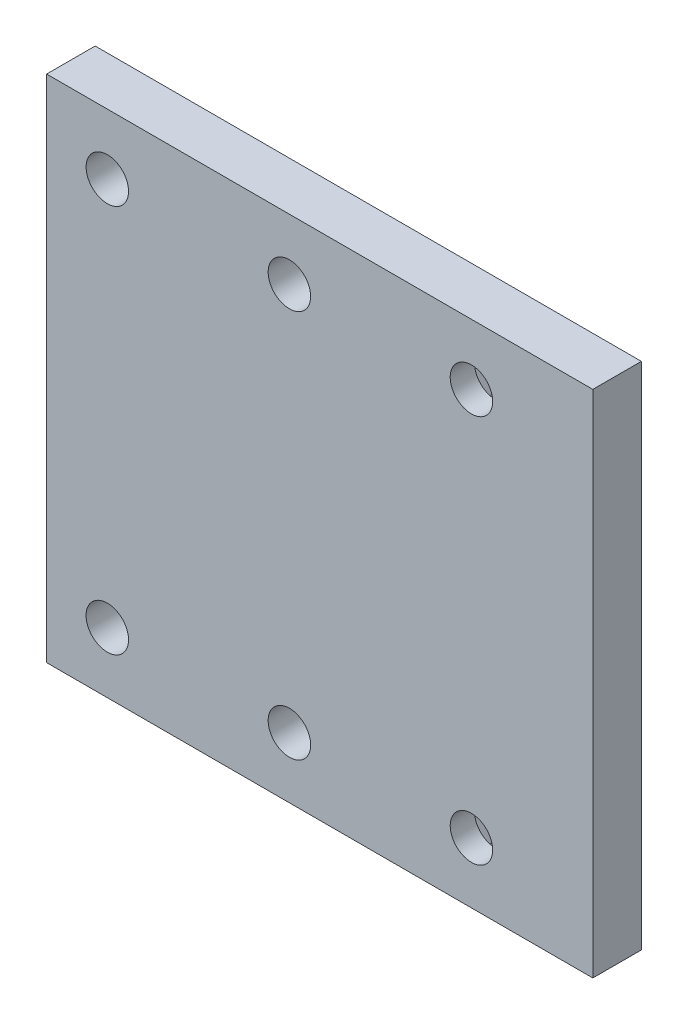
ISO-10303-21;
HEADER;
FILE_DESCRIPTION(('STEP AP214'),'2;1');
FILE_NAME('part.step','',(''),(''),'','','');
FILE_SCHEMA(('AUTOMOTIVE_DESIGN { 1 0 10303 214 1 1 1 1 }'));
ENDSEC;
DATA;
#1=APPLICATION_CONTEXT('core data for automotive mechanical design processes');
#2=APPLICATION_PROTOCOL_DEFINITION('international standard','automotive_design',2000,#1);
#3=PRODUCT_CONTEXT('',#1,'mechanical');
#4=PRODUCT('Part','Part','',(#3));
#5=PRODUCT_RELATED_PRODUCT_CATEGORY('part','',(#4));
#6=PRODUCT_DEFINITION_FORMATION('','',#4);
#7=PRODUCT_DEFINITION_CONTEXT('part definition',#1,'design');
#8=PRODUCT_DEFINITION('design','',#6,#7);
#9=PRODUCT_DEFINITION_SHAPE('','',#8);
#10=(LENGTH_UNIT() NAMED_UNIT(*) SI_UNIT(.MILLI.,.METRE.));
#11=(NAMED_UNIT(*) PLANE_ANGLE_UNIT() SI_UNIT($,.RADIAN.));
#12=(NAMED_UNIT(*) SI_UNIT($,.STERADIAN.) SOLID_ANGLE_UNIT());
#13=UNCERTAINTY_MEASURE_WITH_UNIT(LENGTH_MEASURE(1.E-05),#10,'distance_accuracy_value','');
#14=(GEOMETRIC_REPRESENTATION_CONTEXT(3) GLOBAL_UNCERTAINTY_ASSIGNED_CONTEXT((#13)) GLOBAL_UNIT_ASSIGNED_CONTEXT((#10,
#11,#12)) REPRESENTATION_CONTEXT('',''));
#15=CARTESIAN_POINT('',(0.,0.,0.));
#16=DIRECTION('',(0.,0.,1.));
#17=DIRECTION('',(1.,0.,0.));
#18=AXIS2_PLACEMENT_3D('',#15,#16,#17);
#19=CARTESIAN_POINT('',(12.5,-16.,0.));
#20=DIRECTION('',(0.,0.,1.));
#21=DIRECTION('',(1.,0.,0.));
#22=AXIS2_PLACEMENT_3D('',#19,#20,#21);
#23=CYLINDRICAL_SURFACE('',#22,1.75);
#24=CARTESIAN_POINT('',(12.5,-16.,4.));
#25=DIRECTION('',(0.,0.,1.));
#26=DIRECTION('',(-1.,0.,0.));
#27=AXIS2_PLACEMENT_3D('',#24,#25,#26);
#28=CIRCLE('',#27,1.75);
#29=CARTESIAN_POINT('',(10.75,-16.,4.));
#30=VERTEX_POINT('',#29);
#31=EDGE_CURVE('E250',#30,#30,#28,.T.);
#32=ORIENTED_EDGE('',*,*,#31,.T.);
#33=EDGE_LOOP('',(#32));
#34=FACE_BOUND('',#33,.T.);
#35=CARTESIAN_POINT('',(12.5,-16.,2.));
#36=DIRECTION('',(0.,0.,-1.));
#37=DIRECTION('',(-1.,0.,0.));
#38=AXIS2_PLACEMENT_3D('',#35,#36,#37);
#39=CIRCLE('',#38,1.75);
#40=CARTESIAN_POINT('',(10.75,-16.,2.));
#41=VERTEX_POINT('',#40);
#42=EDGE_CURVE('E240',#41,#41,#39,.F.);
#43=ORIENTED_EDGE('',*,*,#42,.F.);
#44=EDGE_LOOP('',(#43));
#45=FACE_BOUND('',#44,.T.);
#46=ADVANCED_FACE('F33',(#34,#45),#23,.F.);
#47=CARTESIAN_POINT('',(22.5,21.,4.));
#48=DIRECTION('',(-1.,0.,0.));
#49=DIRECTION('',(0.,-1.,0.));
#50=AXIS2_PLACEMENT_3D('',#47,#48,#49);
#51=PLANE('',#50);
#52=DIRECTION('',(0.,1.,0.));
#53=VECTOR('',#52,1.);
#54=CARTESIAN_POINT('',(22.5,21.,0.));
#55=LINE('',#54,#53);
#56=CARTESIAN_POINT('',(22.5,-21.,0.));
#57=VERTEX_POINT('',#56);
#58=CARTESIAN_POINT('',(22.5,21.,0.));
#59=VERTEX_POINT('',#58);
#60=EDGE_CURVE('E278',#57,#59,#55,.T.);
#61=ORIENTED_EDGE('',*,*,#60,.T.);
#62=DIRECTION('',(0.,0.,-1.));
#63=VECTOR('',#62,1.);
#64=CARTESIAN_POINT('',(22.5,21.,4.));
#65=LINE('',#64,#63);
#66=CARTESIAN_POINT('',(22.5,21.,4.));
#67=VERTEX_POINT('',#66);
#68=EDGE_CURVE('E11',#67,#59,#65,.T.);
#69=ORIENTED_EDGE('',*,*,#68,.F.);
#70=DIRECTION('',(0.,1.,0.));
#71=VECTOR('',#70,1.);
#72=CARTESIAN_POINT('',(22.5,21.,4.));
#73=LINE('',#72,#71);
#74=CARTESIAN_POINT('',(22.5,-21.,4.));
#75=VERTEX_POINT('',#74);
#76=EDGE_CURVE('E281',#75,#67,#73,.T.);
#77=ORIENTED_EDGE('',*,*,#76,.F.);
#78=DIRECTION('',(0.,0.,-1.));
#79=VECTOR('',#78,1.);
#80=CARTESIAN_POINT('',(22.5,-21.,4.));
#81=LINE('',#80,#79);
#82=EDGE_CURVE('E291',#75,#57,#81,.T.);
#83=ORIENTED_EDGE('',*,*,#82,.T.);
#84=EDGE_LOOP('',(#61,#69,#77,#83));
#85=FACE_BOUND('',#84,.T.);
#86=ADVANCED_FACE('F35',(#85),#51,.F.);
#87=CARTESIAN_POINT('',(-22.5,21.,4.));
#88=DIRECTION('',(0.,-1.,0.));
#89=DIRECTION('',(0.,0.,-1.));
#90=AXIS2_PLACEMENT_3D('',#87,#88,#89);
#91=PLANE('',#90);
#92=DIRECTION('',(-1.,0.,0.));
#93=VECTOR('',#92,1.);
#94=CARTESIAN_POINT('',(-22.5,21.,0.));
#95=LINE('',#94,#93);
#96=CARTESIAN_POINT('',(-22.5,21.,0.));
#97=VERTEX_POINT('',#96);
#98=EDGE_CURVE('E294',#59,#97,#95,.T.);
#99=ORIENTED_EDGE('',*,*,#98,.T.);
#100=DIRECTION('',(0.,0.,-1.));
#101=VECTOR('',#100,1.);
#102=CARTESIAN_POINT('',(-22.5,21.,4.));
#103=LINE('',#102,#101);
#104=CARTESIAN_POINT('',(-22.5,21.,4.));
#105=VERTEX_POINT('',#104);
#106=EDGE_CURVE('E42',#105,#97,#103,.T.);
#107=ORIENTED_EDGE('',*,*,#106,.F.);
#108=DIRECTION('',(-1.,0.,0.));
#109=VECTOR('',#108,1.);
#110=CARTESIAN_POINT('',(-22.5,21.,4.));
#111=LINE('',#110,#109);
#112=EDGE_CURVE('E284',#67,#105,#111,.T.);
#113=ORIENTED_EDGE('',*,*,#112,.F.);
#114=ORIENTED_EDGE('',*,*,#68,.T.);
#115=EDGE_LOOP('',(#99,#107,#113,#114));
#116=FACE_BOUND('',#115,.T.);
#117=ADVANCED_FACE('F318',(#116),#91,.F.);
#118=CARTESIAN_POINT('',(-22.5,21.,4.));
#119=DIRECTION('',(1.,0.,0.));
#120=DIRECTION('',(0.,0.,-1.));
#121=AXIS2_PLACEMENT_3D('',#118,#119,#120);
#122=PLANE('',#121);
#123=DIRECTION('',(0.,-1.,0.));
#124=VECTOR('',#123,1.);
#125=CARTESIAN_POINT('',(-22.5,21.,0.));
#126=LINE('',#125,#124);
#127=CARTESIAN_POINT('',(-22.5,-21.,0.));
#128=VERTEX_POINT('',#127);
#129=EDGE_CURVE('E296',#97,#128,#126,.T.);
#130=ORIENTED_EDGE('',*,*,#129,.T.);
#131=DIRECTION('',(0.,0.,-1.));
#132=VECTOR('',#131,1.);
#133=CARTESIAN_POINT('',(-22.5,-21.,4.));
#134=LINE('',#133,#132);
#135=CARTESIAN_POINT('',(-22.5,-21.,4.));
#136=VERTEX_POINT('',#135);
#137=EDGE_CURVE('E301',#136,#128,#134,.T.);
#138=ORIENTED_EDGE('',*,*,#137,.F.);
#139=DIRECTION('',(0.,-1.,0.));
#140=VECTOR('',#139,1.);
#141=CARTESIAN_POINT('',(-22.5,21.,4.));
#142=LINE('',#141,#140);
#143=EDGE_CURVE('E287',#105,#136,#142,.T.);
#144=ORIENTED_EDGE('',*,*,#143,.F.);
#145=ORIENTED_EDGE('',*,*,#106,.T.);
#146=EDGE_LOOP('',(#130,#138,#144,#145));
#147=FACE_BOUND('',#146,.T.);
#148=ADVANCED_FACE('F353',(#147),#122,.F.);
#149=CARTESIAN_POINT('',(-22.5,-21.,4.));
#150=DIRECTION('',(0.,1.,0.));
#151=DIRECTION('',(0.,0.,1.));
#152=AXIS2_PLACEMENT_3D('',#149,#150,#151);
#153=PLANE('',#152);
#154=DIRECTION('',(1.,0.,0.));
#155=VECTOR('',#154,1.);
#156=CARTESIAN_POINT('',(-22.5,-21.,0.));
#157=LINE('',#156,#155);
#158=EDGE_CURVE('E285',#128,#57,#157,.T.);
#159=ORIENTED_EDGE('',*,*,#158,.T.);
#160=ORIENTED_EDGE('',*,*,#82,.F.);
#161=DIRECTION('',(1.,0.,0.));
#162=VECTOR('',#161,1.);
#163=CARTESIAN_POINT('',(-22.5,-21.,4.));
#164=LINE('',#163,#162);
#165=EDGE_CURVE('E289',#136,#75,#164,.T.);
#166=ORIENTED_EDGE('',*,*,#165,.F.);
#167=ORIENTED_EDGE('',*,*,#137,.T.);
#168=EDGE_LOOP('',(#159,#160,#166,#167));
#169=FACE_BOUND('',#168,.T.);
#170=ADVANCED_FACE('F346',(#169),#153,.F.);
#171=CARTESIAN_POINT('',(0.,0.,4.));
#172=DIRECTION('',(0.,0.,1.));
#173=DIRECTION('',(1.,0.,0.));
#174=AXIS2_PLACEMENT_3D('',#171,#172,#173);
#175=PLANE('',#174);
#176=ORIENTED_EDGE('',*,*,#31,.F.);
#177=EDGE_LOOP('',(#176));
#178=FACE_BOUND('',#177,.T.);
#179=CARTESIAN_POINT('',(12.5,16.,4.));
#180=DIRECTION('',(0.,0.,1.));
#181=DIRECTION('',(1.,0.,0.));
#182=AXIS2_PLACEMENT_3D('',#179,#180,#181);
#183=CIRCLE('',#182,1.75);
#184=CARTESIAN_POINT('',(14.25,16.,4.));
#185=VERTEX_POINT('',#184);
#186=EDGE_CURVE('E253',#185,#185,#183,.T.);
#187=ORIENTED_EDGE('',*,*,#186,.F.);
#188=EDGE_LOOP('',(#187));
#189=FACE_BOUND('',#188,.T.);
#190=CARTESIAN_POINT('',(-17.5,-16.,4.));
#191=DIRECTION('',(0.,0.,1.));
#192=DIRECTION('',(-1.,0.,0.));
#193=AXIS2_PLACEMENT_3D('',#190,#191,#192);
#194=CIRCLE('',#193,1.75);
#195=CARTESIAN_POINT('',(-19.25,-16.,4.));
#196=VERTEX_POINT('',#195);
#197=EDGE_CURVE('E256',#196,#196,#194,.T.);
#198=ORIENTED_EDGE('',*,*,#197,.F.);
#199=EDGE_LOOP('',(#198));
#200=FACE_BOUND('',#199,.T.);
#201=CARTESIAN_POINT('',(-2.5,-16.,4.));
#202=DIRECTION('',(0.,0.,1.));
#203=DIRECTION('',(-1.,0.,0.));
#204=AXIS2_PLACEMENT_3D('',#201,#202,#203);
#205=CIRCLE('',#204,1.75);
#206=CARTESIAN_POINT('',(-4.25,-16.,4.));
#207=VERTEX_POINT('',#206);
#208=EDGE_CURVE('E260',#207,#207,#205,.T.);
#209=ORIENTED_EDGE('',*,*,#208,.F.);
#210=EDGE_LOOP('',(#209));
#211=FACE_BOUND('',#210,.T.);
#212=CARTESIAN_POINT('',(-2.5,16.,4.));
#213=DIRECTION('',(0.,0.,1.));
#214=DIRECTION('',(1.,0.,0.));
#215=AXIS2_PLACEMENT_3D('',#212,#213,#214);
#216=CIRCLE('',#215,1.75);
#217=CARTESIAN_POINT('',(-0.750000000000001,16.,4.));
#218=VERTEX_POINT('',#217);
#219=EDGE_CURVE('E266',#218,#218,#216,.T.);
#220=ORIENTED_EDGE('',*,*,#219,.F.);
#221=EDGE_LOOP('',(#220));
#222=FACE_BOUND('',#221,.T.);
#223=CARTESIAN_POINT('',(-17.5,16.,4.));
#224=DIRECTION('',(0.,0.,1.));
#225=DIRECTION('',(1.,0.,0.));
#226=AXIS2_PLACEMENT_3D('',#223,#224,#225);
#227=CIRCLE('',#226,1.75);
#228=CARTESIAN_POINT('',(-15.75,16.,4.));
#229=VERTEX_POINT('',#228);
#230=EDGE_CURVE('E272',#229,#229,#227,.T.);
#231=ORIENTED_EDGE('',*,*,#230,.F.);
#232=EDGE_LOOP('',(#231));
#233=FACE_BOUND('',#232,.T.);
#234=ORIENTED_EDGE('',*,*,#76,.T.);
#235=ORIENTED_EDGE('',*,*,#112,.T.);
#236=ORIENTED_EDGE('',*,*,#143,.T.);
#237=ORIENTED_EDGE('',*,*,#165,.T.);
#238=EDGE_LOOP('',(#234,#235,#236,#237));
#239=FACE_BOUND('',#238,.T.);
#240=ADVANCED_FACE('F343',(#178,#189,#200,#211,#222,#233,#239),#175,.T.);
#241=CARTESIAN_POINT('',(0.,0.,0.));
#242=DIRECTION('',(0.,0.,1.));
#243=DIRECTION('',(1.,0.,0.));
#244=AXIS2_PLACEMENT_3D('',#241,#242,#243);
#245=PLANE('',#244);
#246=DIRECTION('',(0.5,-0.866025403784439,0.));
#247=VECTOR('',#246,1.);
#248=CARTESIAN_POINT('',(15.7908965343809,16.,0.));
#249=LINE('',#248,#247);
#250=CARTESIAN_POINT('',(14.1454482671904,18.85,0.));
#251=VERTEX_POINT('',#250);
#252=CARTESIAN_POINT('',(15.7908965343809,16.,0.));
#253=VERTEX_POINT('',#252);
#254=EDGE_CURVE('E184',#251,#253,#249,.T.);
#255=ORIENTED_EDGE('',*,*,#254,.F.);
#256=DIRECTION('',(1.,0.,0.));
#257=VECTOR('',#256,1.);
#258=CARTESIAN_POINT('',(14.1454482671904,18.85,0.));
#259=LINE('',#258,#257);
#260=CARTESIAN_POINT('',(10.8545517328096,18.85,0.));
#261=VERTEX_POINT('',#260);
#262=EDGE_CURVE('E50',#261,#251,#259,.T.);
#263=ORIENTED_EDGE('',*,*,#262,.F.);
#264=DIRECTION('',(0.5,0.866025403784438,0.));
#265=VECTOR('',#264,1.);
#266=CARTESIAN_POINT('',(10.8545517328096,18.85,0.));
#267=LINE('',#266,#265);
#268=CARTESIAN_POINT('',(9.20910346561914,16.,0.));
#269=VERTEX_POINT('',#268);
#270=EDGE_CURVE('E170',#269,#261,#267,.T.);
#271=ORIENTED_EDGE('',*,*,#270,.F.);
#272=DIRECTION('',(-0.5,0.866025403784439,0.));
#273=VECTOR('',#272,1.);
#274=CARTESIAN_POINT('',(9.20910346561914,16.,0.));
#275=LINE('',#274,#273);
#276=CARTESIAN_POINT('',(10.8545517328096,13.15,0.));
#277=VERTEX_POINT('',#276);
#278=EDGE_CURVE('E173',#277,#269,#275,.T.);
#279=ORIENTED_EDGE('',*,*,#278,.F.);
#280=DIRECTION('',(-1.,0.,0.));
#281=VECTOR('',#280,1.);
#282=CARTESIAN_POINT('',(10.8545517328096,13.15,0.));
#283=LINE('',#282,#281);
#284=CARTESIAN_POINT('',(14.1454482671904,13.15,0.));
#285=VERTEX_POINT('',#284);
#286=EDGE_CURVE('E189',#285,#277,#283,.T.);
#287=ORIENTED_EDGE('',*,*,#286,.F.);
#288=DIRECTION('',(-0.5,-0.866025403784439,0.));
#289=VECTOR('',#288,1.);
#290=CARTESIAN_POINT('',(14.1454482671904,13.15,0.));
#291=LINE('',#290,#289);
#292=EDGE_CURVE('E186',#253,#285,#291,.T.);
#293=ORIENTED_EDGE('',*,*,#292,.F.);
#294=EDGE_LOOP('',(#255,#263,#271,#279,#287,#293));
#295=FACE_BOUND('',#294,.T.);
#296=DIRECTION('',(0.5,0.866025403784439,0.));
#297=VECTOR('',#296,1.);
#298=CARTESIAN_POINT('',(9.20910346561914,-16.,0.));
#299=LINE('',#298,#297);
#300=CARTESIAN_POINT('',(9.20910346561914,-16.,0.));
#301=VERTEX_POINT('',#300);
#302=CARTESIAN_POINT('',(10.8545517328096,-13.15,0.));
#303=VERTEX_POINT('',#302);
#304=EDGE_CURVE('E224',#301,#303,#299,.T.);
#305=ORIENTED_EDGE('',*,*,#304,.F.);
#306=DIRECTION('',(-0.5,0.866025403784438,0.));
#307=VECTOR('',#306,1.);
#308=CARTESIAN_POINT('',(10.8545517328096,-18.85,0.));
#309=LINE('',#308,#307);
#310=CARTESIAN_POINT('',(10.8545517328096,-18.85,0.));
#311=VERTEX_POINT('',#310);
#312=EDGE_CURVE('E58',#311,#301,#309,.T.);
#313=ORIENTED_EDGE('',*,*,#312,.F.);
#314=DIRECTION('',(-1.,0.,0.));
#315=VECTOR('',#314,1.);
#316=CARTESIAN_POINT('',(14.1454482671904,-18.85,0.));
#317=LINE('',#316,#315);
#318=CARTESIAN_POINT('',(14.1454482671904,-18.85,0.));
#319=VERTEX_POINT('',#318);
#320=EDGE_CURVE('E207',#319,#311,#317,.T.);
#321=ORIENTED_EDGE('',*,*,#320,.F.);
#322=DIRECTION('',(-0.5,-0.866025403784439,0.));
#323=VECTOR('',#322,1.);
#324=CARTESIAN_POINT('',(15.7908965343809,-16.,0.));
#325=LINE('',#324,#323);
#326=CARTESIAN_POINT('',(15.7908965343809,-16.,0.));
#327=VERTEX_POINT('',#326);
#328=EDGE_CURVE('E233',#327,#319,#325,.T.);
#329=ORIENTED_EDGE('',*,*,#328,.F.);
#330=DIRECTION('',(0.5,-0.866025403784439,0.));
#331=VECTOR('',#330,1.);
#332=CARTESIAN_POINT('',(14.1454482671904,-13.15,0.));
#333=LINE('',#332,#331);
#334=CARTESIAN_POINT('',(14.1454482671904,-13.15,0.));
#335=VERTEX_POINT('',#334);
#336=EDGE_CURVE('E230',#335,#327,#333,.T.);
#337=ORIENTED_EDGE('',*,*,#336,.F.);
#338=DIRECTION('',(1.,0.,0.));
#339=VECTOR('',#338,1.);
#340=CARTESIAN_POINT('',(10.8545517328096,-13.15,0.));
#341=LINE('',#340,#339);
#342=EDGE_CURVE('E227',#303,#335,#341,.T.);
#343=ORIENTED_EDGE('',*,*,#342,.F.);
#344=EDGE_LOOP('',(#305,#313,#321,#329,#337,#343));
#345=FACE_BOUND('',#344,.T.);
#346=CARTESIAN_POINT('',(-17.5,-16.,0.));
#347=DIRECTION('',(0.,0.,1.));
#348=DIRECTION('',(-1.,0.,0.));
#349=AXIS2_PLACEMENT_3D('',#346,#347,#348);
#350=CIRCLE('',#349,1.75);
#351=CARTESIAN_POINT('',(-19.25,-16.,0.));
#352=VERTEX_POINT('',#351);
#353=EDGE_CURVE('E257',#352,#352,#350,.T.);
#354=ORIENTED_EDGE('',*,*,#353,.T.);
#355=EDGE_LOOP('',(#354));
#356=FACE_BOUND('',#355,.T.);
#357=CARTESIAN_POINT('',(-2.5,-16.,0.));
#358=DIRECTION('',(0.,0.,1.));
#359=DIRECTION('',(-1.,0.,0.));
#360=AXIS2_PLACEMENT_3D('',#357,#358,#359);
#361=CIRCLE('',#360,1.75);
#362=CARTESIAN_POINT('',(-4.25,-16.,0.));
#363=VERTEX_POINT('',#362);
#364=EDGE_CURVE('E263',#363,#363,#361,.T.);
#365=ORIENTED_EDGE('',*,*,#364,.T.);
#366=EDGE_LOOP('',(#365));
#367=FACE_BOUND('',#366,.T.);
#368=CARTESIAN_POINT('',(-2.5,16.,0.));
#369=DIRECTION('',(0.,0.,1.));
#370=DIRECTION('',(1.,0.,0.));
#371=AXIS2_PLACEMENT_3D('',#368,#369,#370);
#372=CIRCLE('',#371,1.75);
#373=CARTESIAN_POINT('',(-0.750000000000001,16.,0.));
#374=VERTEX_POINT('',#373);
#375=EDGE_CURVE('E269',#374,#374,#372,.T.);
#376=ORIENTED_EDGE('',*,*,#375,.T.);
#377=EDGE_LOOP('',(#376));
#378=FACE_BOUND('',#377,.T.);
#379=CARTESIAN_POINT('',(-17.5,16.,0.));
#380=DIRECTION('',(0.,0.,1.));
#381=DIRECTION('',(1.,0.,0.));
#382=AXIS2_PLACEMENT_3D('',#379,#380,#381);
#383=CIRCLE('',#382,1.75);
#384=CARTESIAN_POINT('',(-15.75,16.,0.));
#385=VERTEX_POINT('',#384);
#386=EDGE_CURVE('E275',#385,#385,#383,.T.);
#387=ORIENTED_EDGE('',*,*,#386,.T.);
#388=EDGE_LOOP('',(#387));
#389=FACE_BOUND('',#388,.T.);
#390=ORIENTED_EDGE('',*,*,#60,.F.);
#391=ORIENTED_EDGE('',*,*,#158,.F.);
#392=ORIENTED_EDGE('',*,*,#129,.F.);
#393=ORIENTED_EDGE('',*,*,#98,.F.);
#394=EDGE_LOOP('',(#390,#391,#392,#393));
#395=FACE_BOUND('',#394,.T.);
#396=ADVANCED_FACE('F341',(#295,#345,#356,#367,#378,#389,#395),#245,.F.);
#397=CARTESIAN_POINT('',(-17.5,16.,0.));
#398=DIRECTION('',(0.,0.,1.));
#399=DIRECTION('',(1.,0.,0.));
#400=AXIS2_PLACEMENT_3D('',#397,#398,#399);
#401=CYLINDRICAL_SURFACE('',#400,1.75);
#402=ORIENTED_EDGE('',*,*,#386,.F.);
#403=EDGE_LOOP('',(#402));
#404=FACE_BOUND('',#403,.T.);
#405=ORIENTED_EDGE('',*,*,#230,.T.);
#406=EDGE_LOOP('',(#405));
#407=FACE_BOUND('',#406,.T.);
#408=ADVANCED_FACE('F337',(#404,#407),#401,.F.);
#409=CARTESIAN_POINT('',(-2.5,16.,0.));
#410=DIRECTION('',(0.,0.,1.));
#411=DIRECTION('',(1.,0.,0.));
#412=AXIS2_PLACEMENT_3D('',#409,#410,#411);
#413=CYLINDRICAL_SURFACE('',#412,1.75);
#414=ORIENTED_EDGE('',*,*,#375,.F.);
#415=EDGE_LOOP('',(#414));
#416=FACE_BOUND('',#415,.T.);
#417=ORIENTED_EDGE('',*,*,#219,.T.);
#418=EDGE_LOOP('',(#417));
#419=FACE_BOUND('',#418,.T.);
#420=ADVANCED_FACE('F333',(#416,#419),#413,.F.);
#421=CARTESIAN_POINT('',(-2.5,-16.,0.));
#422=DIRECTION('',(0.,0.,1.));
#423=DIRECTION('',(1.,0.,0.));
#424=AXIS2_PLACEMENT_3D('',#421,#422,#423);
#425=CYLINDRICAL_SURFACE('',#424,1.75);
#426=ORIENTED_EDGE('',*,*,#364,.F.);
#427=EDGE_LOOP('',(#426));
#428=FACE_BOUND('',#427,.T.);
#429=ORIENTED_EDGE('',*,*,#208,.T.);
#430=EDGE_LOOP('',(#429));
#431=FACE_BOUND('',#430,.T.);
#432=ADVANCED_FACE('F329',(#428,#431),#425,.F.);
#433=CARTESIAN_POINT('',(-17.5,-16.,0.));
#434=DIRECTION('',(0.,0.,1.));
#435=DIRECTION('',(1.,0.,0.));
#436=AXIS2_PLACEMENT_3D('',#433,#434,#435);
#437=CYLINDRICAL_SURFACE('',#436,1.75);
#438=ORIENTED_EDGE('',*,*,#353,.F.);
#439=EDGE_LOOP('',(#438));
#440=FACE_BOUND('',#439,.T.);
#441=ORIENTED_EDGE('',*,*,#197,.T.);
#442=EDGE_LOOP('',(#441));
#443=FACE_BOUND('',#442,.T.);
#444=ADVANCED_FACE('F326',(#440,#443),#437,.F.);
#445=CARTESIAN_POINT('',(12.5,16.,0.));
#446=DIRECTION('',(0.,0.,1.));
#447=DIRECTION('',(1.,0.,0.));
#448=AXIS2_PLACEMENT_3D('',#445,#446,#447);
#449=CYLINDRICAL_SURFACE('',#448,1.75);
#450=CARTESIAN_POINT('',(12.5,16.,2.));
#451=DIRECTION('',(0.,0.,1.));
#452=DIRECTION('',(1.,0.,0.));
#453=AXIS2_PLACEMENT_3D('',#450,#451,#452);
#454=CIRCLE('',#453,1.75);
#455=CARTESIAN_POINT('',(14.25,16.,2.));
#456=VERTEX_POINT('',#455);
#457=EDGE_CURVE('E37',#456,#456,#454,.F.);
#458=ORIENTED_EDGE('',*,*,#457,.T.);
#459=EDGE_LOOP('',(#458));
#460=FACE_BOUND('',#459,.T.);
#461=ORIENTED_EDGE('',*,*,#186,.T.);
#462=EDGE_LOOP('',(#461));
#463=FACE_BOUND('',#462,.T.);
#464=ADVANCED_FACE('F324',(#460,#463),#449,.F.);
#465=CARTESIAN_POINT('',(0.,0.,2.));
#466=DIRECTION('',(0.,0.,-1.));
#467=DIRECTION('',(-1.,0.,0.));
#468=AXIS2_PLACEMENT_3D('',#465,#466,#467);
#469=PLANE('',#468);
#470=DIRECTION('',(-0.5,0.866025403784438,0.));
#471=VECTOR('',#470,1.);
#472=CARTESIAN_POINT('',(10.8545517328096,-18.85,2.));
#473=LINE('',#472,#471);
#474=CARTESIAN_POINT('',(10.8545517328096,-18.85,2.));
#475=VERTEX_POINT('',#474);
#476=CARTESIAN_POINT('',(9.20910346561914,-16.,2.));
#477=VERTEX_POINT('',#476);
#478=EDGE_CURVE('E203',#475,#477,#473,.T.);
#479=ORIENTED_EDGE('',*,*,#478,.T.);
#480=DIRECTION('',(0.5,0.866025403784439,0.));
#481=VECTOR('',#480,1.);
#482=CARTESIAN_POINT('',(9.20910346561914,-16.,2.));
#483=LINE('',#482,#481);
#484=CARTESIAN_POINT('',(10.8545517328096,-13.15,2.));
#485=VERTEX_POINT('',#484);
#486=EDGE_CURVE('E206',#477,#485,#483,.T.);
#487=ORIENTED_EDGE('',*,*,#486,.T.);
#488=DIRECTION('',(1.,0.,0.));
#489=VECTOR('',#488,1.);
#490=CARTESIAN_POINT('',(10.8545517328096,-13.15,2.));
#491=LINE('',#490,#489);
#492=CARTESIAN_POINT('',(14.1454482671904,-13.15,2.));
#493=VERTEX_POINT('',#492);
#494=EDGE_CURVE('E210',#485,#493,#491,.T.);
#495=ORIENTED_EDGE('',*,*,#494,.T.);
#496=DIRECTION('',(0.5,-0.866025403784439,0.));
#497=VECTOR('',#496,1.);
#498=CARTESIAN_POINT('',(14.1454482671904,-13.15,2.));
#499=LINE('',#498,#497);
#500=CARTESIAN_POINT('',(15.7908965343809,-16.,2.));
#501=VERTEX_POINT('',#500);
#502=EDGE_CURVE('E213',#493,#501,#499,.T.);
#503=ORIENTED_EDGE('',*,*,#502,.T.);
#504=DIRECTION('',(-0.5,-0.866025403784439,0.));
#505=VECTOR('',#504,1.);
#506=CARTESIAN_POINT('',(15.7908965343809,-16.,2.));
#507=LINE('',#506,#505);
#508=CARTESIAN_POINT('',(14.1454482671904,-18.85,2.));
#509=VERTEX_POINT('',#508);
#510=EDGE_CURVE('E216',#501,#509,#507,.T.);
#511=ORIENTED_EDGE('',*,*,#510,.T.);
#512=DIRECTION('',(-1.,0.,0.));
#513=VECTOR('',#512,1.);
#514=CARTESIAN_POINT('',(14.1454482671904,-18.85,2.));
#515=LINE('',#514,#513);
#516=EDGE_CURVE('E219',#509,#475,#515,.T.);
#517=ORIENTED_EDGE('',*,*,#516,.T.);
#518=EDGE_LOOP('',(#479,#487,#495,#503,#511,#517));
#519=FACE_BOUND('',#518,.T.);
#520=ORIENTED_EDGE('',*,*,#42,.T.);
#521=EDGE_LOOP('',(#520));
#522=FACE_BOUND('',#521,.T.);
#523=ADVANCED_FACE('F308',(#519,#522),#469,.T.);
#524=CARTESIAN_POINT('',(10.8545517328096,-18.85,2.));
#525=DIRECTION('',(-0.866025403784439,-0.5,0.));
#526=DIRECTION('',(0.5,-0.866025403784438,0.));
#527=AXIS2_PLACEMENT_3D('',#524,#525,#526);
#528=PLANE('',#527);
#529=ORIENTED_EDGE('',*,*,#312,.T.);
#530=DIRECTION('',(0.,0.,-1.));
#531=VECTOR('',#530,1.);
#532=CARTESIAN_POINT('',(9.20910346561914,-16.,2.));
#533=LINE('',#532,#531);
#534=EDGE_CURVE('E222',#477,#301,#533,.T.);
#535=ORIENTED_EDGE('',*,*,#534,.F.);
#536=ORIENTED_EDGE('',*,*,#478,.F.);
#537=DIRECTION('',(0.,0.,-1.));
#538=VECTOR('',#537,1.);
#539=CARTESIAN_POINT('',(10.8545517328096,-18.85,2.));
#540=LINE('',#539,#538);
#541=EDGE_CURVE('E238',#475,#311,#540,.T.);
#542=ORIENTED_EDGE('',*,*,#541,.T.);
#543=EDGE_LOOP('',(#529,#535,#536,#542));
#544=FACE_BOUND('',#543,.T.);
#545=ADVANCED_FACE('F322',(#544),#528,.F.);
#546=CARTESIAN_POINT('',(14.1454482671904,-18.85,2.));
#547=DIRECTION('',(0.,-1.,0.));
#548=DIRECTION('',(0.,0.,-1.));
#549=AXIS2_PLACEMENT_3D('',#546,#547,#548);
#550=PLANE('',#549);
#551=ORIENTED_EDGE('',*,*,#320,.T.);
#552=ORIENTED_EDGE('',*,*,#541,.F.);
#553=ORIENTED_EDGE('',*,*,#516,.F.);
#554=DIRECTION('',(0.,0.,-1.));
#555=VECTOR('',#554,1.);
#556=CARTESIAN_POINT('',(14.1454482671904,-18.85,2.));
#557=LINE('',#556,#555);
#558=EDGE_CURVE('E241',#509,#319,#557,.T.);
#559=ORIENTED_EDGE('',*,*,#558,.T.);
#560=EDGE_LOOP('',(#551,#552,#553,#559));
#561=FACE_BOUND('',#560,.T.);
#562=ADVANCED_FACE('F440',(#561),#550,.F.);
#563=CARTESIAN_POINT('',(15.7908965343809,-16.,2.));
#564=DIRECTION('',(0.866025403784439,-0.5,0.));
#565=DIRECTION('',(0.5,0.866025403784439,0.));
#566=AXIS2_PLACEMENT_3D('',#563,#564,#565);
#567=PLANE('',#566);
#568=ORIENTED_EDGE('',*,*,#328,.T.);
#569=ORIENTED_EDGE('',*,*,#558,.F.);
#570=ORIENTED_EDGE('',*,*,#510,.F.);
#571=DIRECTION('',(0.,0.,-1.));
#572=VECTOR('',#571,1.);
#573=CARTESIAN_POINT('',(15.7908965343809,-16.,2.));
#574=LINE('',#573,#572);
#575=EDGE_CURVE('E243',#501,#327,#574,.T.);
#576=ORIENTED_EDGE('',*,*,#575,.T.);
#577=EDGE_LOOP('',(#568,#569,#570,#576));
#578=FACE_BOUND('',#577,.T.);
#579=ADVANCED_FACE('F447',(#578),#567,.F.);
#580=CARTESIAN_POINT('',(14.1454482671904,-13.15,2.));
#581=DIRECTION('',(0.866025403784439,0.5,0.));
#582=DIRECTION('',(-0.5,0.866025403784439,0.));
#583=AXIS2_PLACEMENT_3D('',#580,#581,#582);
#584=PLANE('',#583);
#585=ORIENTED_EDGE('',*,*,#336,.T.);
#586=ORIENTED_EDGE('',*,*,#575,.F.);
#587=ORIENTED_EDGE('',*,*,#502,.F.);
#588=DIRECTION('',(0.,0.,-1.));
#589=VECTOR('',#588,1.);
#590=CARTESIAN_POINT('',(14.1454482671904,-13.15,2.));
#591=LINE('',#590,#589);
#592=EDGE_CURVE('E245',#493,#335,#591,.T.);
#593=ORIENTED_EDGE('',*,*,#592,.T.);
#594=EDGE_LOOP('',(#585,#586,#587,#593));
#595=FACE_BOUND('',#594,.T.);
#596=ADVANCED_FACE('F456',(#595),#584,.F.);
#597=CARTESIAN_POINT('',(10.8545517328096,-13.15,2.));
#598=DIRECTION('',(0.,1.,0.));
#599=DIRECTION('',(0.,0.,1.));
#600=AXIS2_PLACEMENT_3D('',#597,#598,#599);
#601=PLANE('',#600);
#602=ORIENTED_EDGE('',*,*,#342,.T.);
#603=ORIENTED_EDGE('',*,*,#592,.F.);
#604=ORIENTED_EDGE('',*,*,#494,.F.);
#605=DIRECTION('',(0.,0.,-1.));
#606=VECTOR('',#605,1.);
#607=CARTESIAN_POINT('',(10.8545517328096,-13.15,2.));
#608=LINE('',#607,#606);
#609=EDGE_CURVE('E247',#485,#303,#608,.T.);
#610=ORIENTED_EDGE('',*,*,#609,.T.);
#611=EDGE_LOOP('',(#602,#603,#604,#610));
#612=FACE_BOUND('',#611,.T.);
#613=ADVANCED_FACE('F465',(#612),#601,.F.);
#614=CARTESIAN_POINT('',(9.20910346561914,-16.,2.));
#615=DIRECTION('',(-0.866025403784439,0.5,0.));
#616=DIRECTION('',(-0.5,-0.866025403784439,0.));
#617=AXIS2_PLACEMENT_3D('',#614,#615,#616);
#618=PLANE('',#617);
#619=ORIENTED_EDGE('',*,*,#304,.T.);
#620=ORIENTED_EDGE('',*,*,#609,.F.);
#621=ORIENTED_EDGE('',*,*,#486,.F.);
#622=ORIENTED_EDGE('',*,*,#534,.T.);
#623=EDGE_LOOP('',(#619,#620,#621,#622));
#624=FACE_BOUND('',#623,.T.);
#625=ADVANCED_FACE('F474',(#624),#618,.F.);
#626=CARTESIAN_POINT('',(0.,0.,2.));
#627=DIRECTION('',(0.,0.,1.));
#628=DIRECTION('',(1.,0.,0.));
#629=AXIS2_PLACEMENT_3D('',#626,#627,#628);
#630=PLANE('',#629);
#631=DIRECTION('',(1.,0.,0.));
#632=VECTOR('',#631,1.);
#633=CARTESIAN_POINT('',(14.1454482671904,18.85,2.));
#634=LINE('',#633,#632);
#635=CARTESIAN_POINT('',(10.8545517328096,18.85,2.));
#636=VERTEX_POINT('',#635);
#637=CARTESIAN_POINT('',(14.1454482671904,18.85,2.));
#638=VERTEX_POINT('',#637);
#639=EDGE_CURVE('E150',#636,#638,#634,.T.);
#640=ORIENTED_EDGE('',*,*,#639,.T.);
#641=DIRECTION('',(0.5,-0.866025403784439,0.));
#642=VECTOR('',#641,1.);
#643=CARTESIAN_POINT('',(15.7908965343809,16.,2.));
#644=LINE('',#643,#642);
#645=CARTESIAN_POINT('',(15.7908965343809,16.,2.));
#646=VERTEX_POINT('',#645);
#647=EDGE_CURVE('E159',#638,#646,#644,.T.);
#648=ORIENTED_EDGE('',*,*,#647,.T.);
#649=DIRECTION('',(-0.5,-0.866025403784439,0.));
#650=VECTOR('',#649,1.);
#651=CARTESIAN_POINT('',(14.1454482671904,13.15,2.));
#652=LINE('',#651,#650);
#653=CARTESIAN_POINT('',(14.1454482671904,13.15,2.));
#654=VERTEX_POINT('',#653);
#655=EDGE_CURVE('E164',#646,#654,#652,.T.);
#656=ORIENTED_EDGE('',*,*,#655,.T.);
#657=DIRECTION('',(-1.,0.,0.));
#658=VECTOR('',#657,1.);
#659=CARTESIAN_POINT('',(10.8545517328096,13.15,2.));
#660=LINE('',#659,#658);
#661=CARTESIAN_POINT('',(10.8545517328096,13.15,2.));
#662=VERTEX_POINT('',#661);
#663=EDGE_CURVE('E177',#654,#662,#660,.T.);
#664=ORIENTED_EDGE('',*,*,#663,.T.);
#665=DIRECTION('',(-0.5,0.866025403784439,0.));
#666=VECTOR('',#665,1.);
#667=CARTESIAN_POINT('',(9.20910346561914,16.,2.));
#668=LINE('',#667,#666);
#669=CARTESIAN_POINT('',(9.20910346561914,16.,2.));
#670=VERTEX_POINT('',#669);
#671=EDGE_CURVE('E180',#662,#670,#668,.T.);
#672=ORIENTED_EDGE('',*,*,#671,.T.);
#673=DIRECTION('',(0.5,0.866025403784438,0.));
#674=VECTOR('',#673,1.);
#675=CARTESIAN_POINT('',(10.8545517328096,18.85,2.));
#676=LINE('',#675,#674);
#677=EDGE_CURVE('E156',#670,#636,#676,.T.);
#678=ORIENTED_EDGE('',*,*,#677,.T.);
#679=EDGE_LOOP('',(#640,#648,#656,#664,#672,#678));
#680=FACE_BOUND('',#679,.T.);
#681=ORIENTED_EDGE('',*,*,#457,.F.);
#682=EDGE_LOOP('',(#681));
#683=FACE_BOUND('',#682,.T.);
#684=ADVANCED_FACE('F166',(#680,#683),#630,.F.);
#685=CARTESIAN_POINT('',(14.1454482671904,18.85,2.));
#686=DIRECTION('',(0.,1.,0.));
#687=DIRECTION('',(0.,0.,1.));
#688=AXIS2_PLACEMENT_3D('',#685,#686,#687);
#689=PLANE('',#688);
#690=ORIENTED_EDGE('',*,*,#262,.T.);
#691=DIRECTION('',(0.,0.,-1.));
#692=VECTOR('',#691,1.);
#693=CARTESIAN_POINT('',(14.1454482671904,18.85,2.));
#694=LINE('',#693,#692);
#695=EDGE_CURVE('E146',#638,#251,#694,.T.);
#696=ORIENTED_EDGE('',*,*,#695,.F.);
#697=ORIENTED_EDGE('',*,*,#639,.F.);
#698=DIRECTION('',(0.,0.,-1.));
#699=VECTOR('',#698,1.);
#700=CARTESIAN_POINT('',(10.8545517328096,18.85,2.));
#701=LINE('',#700,#699);
#702=EDGE_CURVE('E194',#636,#261,#701,.T.);
#703=ORIENTED_EDGE('',*,*,#702,.T.);
#704=EDGE_LOOP('',(#690,#696,#697,#703));
#705=FACE_BOUND('',#704,.T.);
#706=ADVANCED_FACE('F148',(#705),#689,.F.);
#707=CARTESIAN_POINT('',(10.8545517328096,18.85,2.));
#708=DIRECTION('',(-0.866025403784439,0.5,0.));
#709=DIRECTION('',(-0.5,-0.866025403784438,0.));
#710=AXIS2_PLACEMENT_3D('',#707,#708,#709);
#711=PLANE('',#710);
#712=ORIENTED_EDGE('',*,*,#270,.T.);
#713=ORIENTED_EDGE('',*,*,#702,.F.);
#714=ORIENTED_EDGE('',*,*,#677,.F.);
#715=DIRECTION('',(0.,0.,-1.));
#716=VECTOR('',#715,1.);
#717=CARTESIAN_POINT('',(9.20910346561914,16.,2.));
#718=LINE('',#717,#716);
#719=EDGE_CURVE('E196',#670,#269,#718,.T.);
#720=ORIENTED_EDGE('',*,*,#719,.T.);
#721=EDGE_LOOP('',(#712,#713,#714,#720));
#722=FACE_BOUND('',#721,.T.);
#723=ADVANCED_FACE('F497',(#722),#711,.F.);
#724=CARTESIAN_POINT('',(9.20910346561914,16.,2.));
#725=DIRECTION('',(-0.866025403784439,-0.5,0.));
#726=DIRECTION('',(0.5,-0.866025403784439,0.));
#727=AXIS2_PLACEMENT_3D('',#724,#725,#726);
#728=PLANE('',#727);
#729=ORIENTED_EDGE('',*,*,#278,.T.);
#730=ORIENTED_EDGE('',*,*,#719,.F.);
#731=ORIENTED_EDGE('',*,*,#671,.F.);
#732=DIRECTION('',(0.,0.,-1.));
#733=VECTOR('',#732,1.);
#734=CARTESIAN_POINT('',(10.8545517328096,13.15,2.));
#735=LINE('',#734,#733);
#736=EDGE_CURVE('E198',#662,#277,#735,.T.);
#737=ORIENTED_EDGE('',*,*,#736,.T.);
#738=EDGE_LOOP('',(#729,#730,#731,#737));
#739=FACE_BOUND('',#738,.T.);
#740=ADVANCED_FACE('F505',(#739),#728,.F.);
#741=CARTESIAN_POINT('',(10.8545517328096,13.15,2.));
#742=DIRECTION('',(0.,-1.,0.));
#743=DIRECTION('',(0.,0.,-1.));
#744=AXIS2_PLACEMENT_3D('',#741,#742,#743);
#745=PLANE('',#744);
#746=ORIENTED_EDGE('',*,*,#286,.T.);
#747=ORIENTED_EDGE('',*,*,#736,.F.);
#748=ORIENTED_EDGE('',*,*,#663,.F.);
#749=DIRECTION('',(0.,0.,-1.));
#750=VECTOR('',#749,1.);
#751=CARTESIAN_POINT('',(14.1454482671904,13.15,2.));
#752=LINE('',#751,#750);
#753=EDGE_CURVE('E200',#654,#285,#752,.T.);
#754=ORIENTED_EDGE('',*,*,#753,.T.);
#755=EDGE_LOOP('',(#746,#747,#748,#754));
#756=FACE_BOUND('',#755,.T.);
#757=ADVANCED_FACE('F514',(#756),#745,.F.);
#758=CARTESIAN_POINT('',(14.1454482671904,13.15,2.));
#759=DIRECTION('',(0.866025403784439,-0.5,0.));
#760=DIRECTION('',(0.5,0.866025403784439,0.));
#761=AXIS2_PLACEMENT_3D('',#758,#759,#760);
#762=PLANE('',#761);
#763=ORIENTED_EDGE('',*,*,#292,.T.);
#764=ORIENTED_EDGE('',*,*,#753,.F.);
#765=ORIENTED_EDGE('',*,*,#655,.F.);
#766=DIRECTION('',(0.,0.,-1.));
#767=VECTOR('',#766,1.);
#768=CARTESIAN_POINT('',(15.7908965343809,16.,2.));
#769=LINE('',#768,#767);
#770=EDGE_CURVE('E155',#646,#253,#769,.T.);
#771=ORIENTED_EDGE('',*,*,#770,.T.);
#772=EDGE_LOOP('',(#763,#764,#765,#771));
#773=FACE_BOUND('',#772,.T.);
#774=ADVANCED_FACE('F523',(#773),#762,.F.);
#775=CARTESIAN_POINT('',(15.7908965343809,16.,2.));
#776=DIRECTION('',(0.866025403784439,0.5,0.));
#777=DIRECTION('',(-0.5,0.866025403784439,0.));
#778=AXIS2_PLACEMENT_3D('',#775,#776,#777);
#779=PLANE('',#778);
#780=ORIENTED_EDGE('',*,*,#254,.T.);
#781=ORIENTED_EDGE('',*,*,#770,.F.);
#782=ORIENTED_EDGE('',*,*,#647,.F.);
#783=ORIENTED_EDGE('',*,*,#695,.T.);
#784=EDGE_LOOP('',(#780,#781,#782,#783));
#785=FACE_BOUND('',#784,.T.);
#786=ADVANCED_FACE('F160',(#785),#779,.F.);
#787=CLOSED_SHELL('',(#46,#86,#117,#148,#170,#240,#396,#408,#420,#432,#444,#464,#523,#545,#562,
#579,#596,#613,#625,#684,#706,#723,#740,#757,#774,#786));
#788=MANIFOLD_SOLID_BREP('B2',#787);
#789=ADVANCED_BREP_SHAPE_REPRESENTATION('',(#18,#788),#14);
#790=SHAPE_DEFINITION_REPRESENTATION(#9,#789);
ENDSEC;
END-ISO-10303-21;
